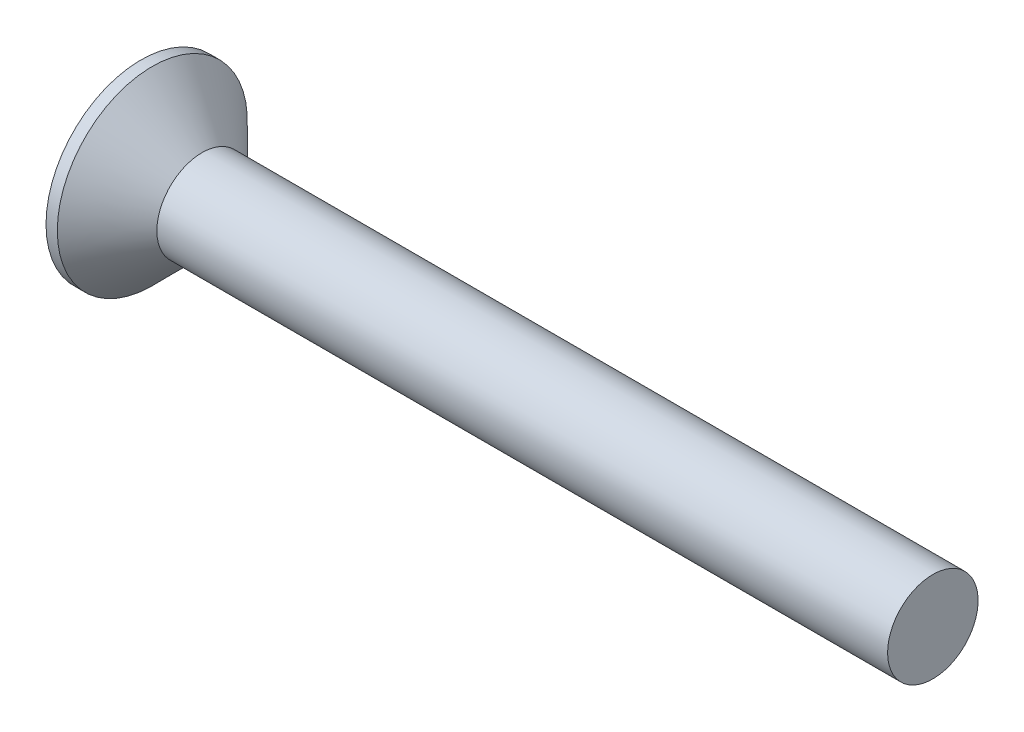
ISO-10303-21;
HEADER;
FILE_DESCRIPTION(('STEP AP214'),'2;1');
FILE_NAME('part.step','',(''),(''),'','','');
FILE_SCHEMA(('AUTOMOTIVE_DESIGN { 1 0 10303 214 1 1 1 1 }'));
ENDSEC;
DATA;
#1=APPLICATION_CONTEXT('core data for automotive mechanical design processes');
#2=APPLICATION_PROTOCOL_DEFINITION('international standard','automotive_design',2000,#1);
#3=PRODUCT_CONTEXT('',#1,'mechanical');
#4=PRODUCT('Part','Part','',(#3));
#5=PRODUCT_RELATED_PRODUCT_CATEGORY('part','',(#4));
#6=PRODUCT_DEFINITION_FORMATION('','',#4);
#7=PRODUCT_DEFINITION_CONTEXT('part definition',#1,'design');
#8=PRODUCT_DEFINITION('design','',#6,#7);
#9=PRODUCT_DEFINITION_SHAPE('','',#8);
#10=(LENGTH_UNIT() NAMED_UNIT(*) SI_UNIT(.MILLI.,.METRE.));
#11=(NAMED_UNIT(*) PLANE_ANGLE_UNIT() SI_UNIT($,.RADIAN.));
#12=(NAMED_UNIT(*) SI_UNIT($,.STERADIAN.) SOLID_ANGLE_UNIT());
#13=UNCERTAINTY_MEASURE_WITH_UNIT(LENGTH_MEASURE(1.E-05),#10,'distance_accuracy_value','');
#14=(GEOMETRIC_REPRESENTATION_CONTEXT(3) GLOBAL_UNCERTAINTY_ASSIGNED_CONTEXT((#13)) GLOBAL_UNIT_ASSIGNED_CONTEXT((#10,
#11,#12)) REPRESENTATION_CONTEXT('',''));
#15=CARTESIAN_POINT('',(0.,0.,0.));
#16=DIRECTION('',(0.,0.,1.));
#17=DIRECTION('',(1.,0.,0.));
#18=AXIS2_PLACEMENT_3D('',#15,#16,#17);
#19=CARTESIAN_POINT('',(0.,0.,0.));
#20=DIRECTION('',(-1.,0.,0.));
#21=DIRECTION('',(0.,0.,1.));
#22=AXIS2_PLACEMENT_3D('',#19,#20,#21);
#23=PLANE('',#22);
#24=CARTESIAN_POINT('',(0.,0.,0.));
#25=DIRECTION('',(-1.,0.,0.));
#26=DIRECTION('',(0.,0.,1.));
#27=AXIS2_PLACEMENT_3D('',#24,#25,#26);
#28=CIRCLE('',#27,4.2);
#29=CARTESIAN_POINT('',(0.,0.,4.2));
#30=VERTEX_POINT('',#29);
#31=EDGE_CURVE('E41',#30,#30,#28,.T.);
#32=ORIENTED_EDGE('',*,*,#31,.T.);
#33=EDGE_LOOP('',(#32));
#34=FACE_BOUND('',#33,.T.);
#35=DIRECTION('',(0.,1.,0.));
#36=VECTOR('',#35,1.);
#37=CARTESIAN_POINT('',(0.,-2.23,-0.48));
#38=LINE('',#37,#36);
#39=CARTESIAN_POINT('',(0.,-2.23,-0.48));
#40=VERTEX_POINT('',#39);
#41=CARTESIAN_POINT('',(0.,-0.479999999999998,-0.48));
#42=VERTEX_POINT('',#41);
#43=EDGE_CURVE('E102',#40,#42,#38,.T.);
#44=ORIENTED_EDGE('',*,*,#43,.T.);
#45=DIRECTION('',(0.,0.,-1.));
#46=VECTOR('',#45,1.);
#47=CARTESIAN_POINT('',(0.,-0.480000000000008,2.23));
#48=LINE('',#47,#46);
#49=CARTESIAN_POINT('',(0.,-0.479999999999992,-2.23));
#50=VERTEX_POINT('',#49);
#51=EDGE_CURVE('E82',#42,#50,#48,.T.);
#52=ORIENTED_EDGE('',*,*,#51,.T.);
#53=DIRECTION('',(0.,1.,0.));
#54=VECTOR('',#53,1.);
#55=CARTESIAN_POINT('',(0.,-0.479999999999992,-2.23));
#56=LINE('',#55,#54);
#57=CARTESIAN_POINT('',(0.,0.480000000000008,-2.23));
#58=VERTEX_POINT('',#57);
#59=EDGE_CURVE('E339',#50,#58,#56,.T.);
#60=ORIENTED_EDGE('',*,*,#59,.T.);
#61=DIRECTION('',(0.,0.,1.));
#62=VECTOR('',#61,1.);
#63=CARTESIAN_POINT('',(0.,0.480000000000008,-2.23));
#64=LINE('',#63,#62);
#65=CARTESIAN_POINT('',(0.,0.480000000000001,-0.48));
#66=VERTEX_POINT('',#65);
#67=EDGE_CURVE('E98',#58,#66,#64,.T.);
#68=ORIENTED_EDGE('',*,*,#67,.T.);
#69=CARTESIAN_POINT('',(0.,2.23,-0.48));
#70=VERTEX_POINT('',#69);
#71=EDGE_CURVE('E92',#66,#70,#38,.T.);
#72=ORIENTED_EDGE('',*,*,#71,.T.);
#73=DIRECTION('',(0.,0.,1.));
#74=VECTOR('',#73,1.);
#75=CARTESIAN_POINT('',(0.,2.23,-0.48));
#76=LINE('',#75,#74);
#77=CARTESIAN_POINT('',(0.,2.23,0.48));
#78=VERTEX_POINT('',#77);
#79=EDGE_CURVE('E95',#70,#78,#76,.T.);
#80=ORIENTED_EDGE('',*,*,#79,.T.);
#81=DIRECTION('',(0.,-1.,0.));
#82=VECTOR('',#81,1.);
#83=CARTESIAN_POINT('',(0.,2.23,0.48));
#84=LINE('',#83,#82);
#85=CARTESIAN_POINT('',(0.,0.479999999999998,0.48));
#86=VERTEX_POINT('',#85);
#87=EDGE_CURVE('E351',#78,#86,#84,.T.);
#88=ORIENTED_EDGE('',*,*,#87,.T.);
#89=CARTESIAN_POINT('',(0.,0.479999999999992,2.23));
#90=VERTEX_POINT('',#89);
#91=EDGE_CURVE('E334',#86,#90,#64,.T.);
#92=ORIENTED_EDGE('',*,*,#91,.T.);
#93=DIRECTION('',(0.,-1.,0.));
#94=VECTOR('',#93,1.);
#95=CARTESIAN_POINT('',(0.,0.479999999999992,2.23));
#96=LINE('',#95,#94);
#97=CARTESIAN_POINT('',(0.,-0.480000000000008,2.23));
#98=VERTEX_POINT('',#97);
#99=EDGE_CURVE('E320',#90,#98,#96,.T.);
#100=ORIENTED_EDGE('',*,*,#99,.T.);
#101=CARTESIAN_POINT('',(0.,-0.480000000000002,0.48));
#102=VERTEX_POINT('',#101);
#103=EDGE_CURVE('E332',#98,#102,#48,.T.);
#104=ORIENTED_EDGE('',*,*,#103,.T.);
#105=CARTESIAN_POINT('',(0.,-2.23,0.48));
#106=VERTEX_POINT('',#105);
#107=EDGE_CURVE('E108',#102,#106,#84,.T.);
#108=ORIENTED_EDGE('',*,*,#107,.T.);
#109=DIRECTION('',(0.,0.,-1.));
#110=VECTOR('',#109,1.);
#111=CARTESIAN_POINT('',(0.,-2.23,0.48));
#112=LINE('',#111,#110);
#113=EDGE_CURVE('E131',#106,#40,#112,.T.);
#114=ORIENTED_EDGE('',*,*,#113,.T.);
#115=EDGE_LOOP('',(#44,#52,#60,#68,#72,#80,#88,#92,#100,#104,#108,#114));
#116=FACE_BOUND('',#115,.T.);
#117=ADVANCED_FACE('F34',(#34,#116),#23,.T.);
#118=CARTESIAN_POINT('',(2.96959798994975,0.,0.211055276381909));
#119=DIRECTION('',(-0.0901968863789278,0.,-0.995923953767328));
#120=DIRECTION('',(-0.995923953767328,0.,0.0901968863789278));
#121=AXIS2_PLACEMENT_3D('',#118,#119,#120);
#122=PLANE('',#121);
#123=ORIENTED_EDGE('',*,*,#107,.F.);
#124=DIRECTION('',(0.991897347093265,0.0898322125669375,-0.0898322125669372));
#125=VECTOR('',#124,1.);
#126=CARTESIAN_POINT('',(2.98840392964726,-0.209352096937608,0.209352096937607));
#127=LINE('',#126,#125);
#128=CARTESIAN_POINT('',(2.65,-0.240000000000001,0.239999999999999));
#129=VERTEX_POINT('',#128);
#130=EDGE_CURVE('E126',#102,#129,#127,.T.);
#131=ORIENTED_EDGE('',*,*,#130,.T.);
#132=DIRECTION('',(0.797549052549738,0.59891419417886,-0.0722308575894103));
#133=VECTOR('',#132,1.);
#134=CARTESIAN_POINT('',(0.,-2.23,0.48));
#135=LINE('',#134,#133);
#136=EDGE_CURVE('E103',#106,#129,#135,.T.);
#137=ORIENTED_EDGE('',*,*,#136,.F.);
#138=EDGE_LOOP('',(#123,#131,#137));
#139=FACE_BOUND('',#138,.T.);
#140=ADVANCED_FACE('F154',(#139),#122,.T.);
#141=DIRECTION('',(0.797549052549738,-0.59891419417886,-0.0722308575894102));
#142=VECTOR('',#141,1.);
#143=CARTESIAN_POINT('',(0.,2.23,0.48));
#144=LINE('',#143,#142);
#145=CARTESIAN_POINT('',(2.65,0.24,0.24));
#146=VERTEX_POINT('',#145);
#147=EDGE_CURVE('E48',#78,#146,#144,.T.);
#148=ORIENTED_EDGE('',*,*,#147,.T.);
#149=DIRECTION('',(-0.991897347093265,0.0898322125669368,0.0898322125669372));
#150=VECTOR('',#149,1.);
#151=CARTESIAN_POINT('',(2.98840392964726,0.209352096937606,0.209352096937607));
#152=LINE('',#151,#150);
#153=EDGE_CURVE('E347',#146,#86,#152,.T.);
#154=ORIENTED_EDGE('',*,*,#153,.T.);
#155=ORIENTED_EDGE('',*,*,#87,.F.);
#156=EDGE_LOOP('',(#148,#154,#155));
#157=FACE_BOUND('',#156,.T.);
#158=ADVANCED_FACE('F158',(#157),#122,.T.);
#159=CARTESIAN_POINT('',(2.96959798994975,0.,-0.21105527638191));
#160=DIRECTION('',(-0.0901968863789277,0.,0.995923953767328));
#161=DIRECTION('',(0.995923953767328,0.,0.0901968863789277));
#162=AXIS2_PLACEMENT_3D('',#159,#160,#161);
#163=PLANE('',#162);
#164=DIRECTION('',(0.797549052549738,0.59891419417886,0.0722308575894102));
#165=VECTOR('',#164,1.);
#166=CARTESIAN_POINT('',(0.,-2.23,-0.48));
#167=LINE('',#166,#165);
#168=CARTESIAN_POINT('',(2.65,-0.239999999999999,-0.240000000000001));
#169=VERTEX_POINT('',#168);
#170=EDGE_CURVE('E57',#40,#169,#167,.T.);
#171=ORIENTED_EDGE('',*,*,#170,.T.);
#172=DIRECTION('',(-0.991897347093265,-0.0898322125669369,-0.0898322125669372));
#173=VECTOR('',#172,1.);
#174=CARTESIAN_POINT('',(2.98840392964726,-0.209352096937606,-0.209352096937607));
#175=LINE('',#174,#173);
#176=EDGE_CURVE('E11',#169,#42,#175,.T.);
#177=ORIENTED_EDGE('',*,*,#176,.T.);
#178=ORIENTED_EDGE('',*,*,#43,.F.);
#179=EDGE_LOOP('',(#171,#177,#178));
#180=FACE_BOUND('',#179,.T.);
#181=ADVANCED_FACE('F151',(#180),#163,.T.);
#182=ORIENTED_EDGE('',*,*,#71,.F.);
#183=DIRECTION('',(0.991897347093265,-0.0898322125669375,0.0898322125669371));
#184=VECTOR('',#183,1.);
#185=CARTESIAN_POINT('',(2.98840392964726,0.209352096937608,-0.209352096937607));
#186=LINE('',#185,#184);
#187=CARTESIAN_POINT('',(2.65,0.24,-0.24));
#188=VERTEX_POINT('',#187);
#189=EDGE_CURVE('E111',#66,#188,#186,.T.);
#190=ORIENTED_EDGE('',*,*,#189,.T.);
#191=DIRECTION('',(0.797549052549738,-0.59891419417886,0.0722308575894102));
#192=VECTOR('',#191,1.);
#193=CARTESIAN_POINT('',(0.,2.23,-0.48));
#194=LINE('',#193,#192);
#195=EDGE_CURVE('E107',#70,#188,#194,.T.);
#196=ORIENTED_EDGE('',*,*,#195,.F.);
#197=EDGE_LOOP('',(#182,#190,#196));
#198=FACE_BOUND('',#197,.T.);
#199=ADVANCED_FACE('F110',(#198),#163,.T.);
#200=CARTESIAN_POINT('',(-6.34999999999999,0.,0.));
#201=DIRECTION('',(-1.,0.,0.));
#202=DIRECTION('',(0.,0.,1.));
#203=AXIS2_PLACEMENT_3D('',#200,#201,#202);
#204=CYLINDRICAL_SURFACE('',#203,4.2);
#205=CARTESIAN_POINT('',(0.500000000000007,0.,0.));
#206=DIRECTION('',(-1.,0.,0.));
#207=DIRECTION('',(0.,0.,1.));
#208=AXIS2_PLACEMENT_3D('',#205,#206,#207);
#209=CIRCLE('',#208,4.2);
#210=CARTESIAN_POINT('',(0.500000000000007,0.,4.2));
#211=VERTEX_POINT('',#210);
#212=EDGE_CURVE('E134',#211,#211,#209,.T.);
#213=ORIENTED_EDGE('',*,*,#212,.T.);
#214=EDGE_LOOP('',(#213));
#215=FACE_BOUND('',#214,.T.);
#216=ORIENTED_EDGE('',*,*,#31,.F.);
#217=EDGE_LOOP('',(#216));
#218=FACE_BOUND('',#217,.T.);
#219=ADVANCED_FACE('F140',(#215,#218),#204,.T.);
#220=CARTESIAN_POINT('',(0.500000000000007,0.,0.));
#221=DIRECTION('',(-1.,0.,0.));
#222=DIRECTION('',(0.,0.,1.));
#223=AXIS2_PLACEMENT_3D('',#220,#221,#222);
#224=CONICAL_SURFACE('',#223,4.2,0.78539816339745);
#225=CARTESIAN_POINT('',(2.7,0.,0.));
#226=DIRECTION('',(-1.,0.,0.));
#227=DIRECTION('',(0.,0.,1.));
#228=AXIS2_PLACEMENT_3D('',#225,#226,#227);
#229=CIRCLE('',#228,2.);
#230=CARTESIAN_POINT('',(2.7,0.,2.));
#231=VERTEX_POINT('',#230);
#232=EDGE_CURVE('E130',#231,#231,#229,.T.);
#233=ORIENTED_EDGE('',*,*,#232,.T.);
#234=EDGE_LOOP('',(#233));
#235=FACE_BOUND('',#234,.T.);
#236=ORIENTED_EDGE('',*,*,#212,.F.);
#237=EDGE_LOOP('',(#236));
#238=FACE_BOUND('',#237,.T.);
#239=ADVANCED_FACE('F142',(#235,#238),#224,.T.);
#240=CARTESIAN_POINT('',(-6.34999999999999,0.,0.));
#241=DIRECTION('',(-1.,0.,0.));
#242=DIRECTION('',(0.,0.,1.));
#243=AXIS2_PLACEMENT_3D('',#240,#241,#242);
#244=CYLINDRICAL_SURFACE('',#243,2.);
#245=CARTESIAN_POINT('',(35.,0.,0.));
#246=DIRECTION('',(-1.,0.,0.));
#247=DIRECTION('',(0.,0.,1.));
#248=AXIS2_PLACEMENT_3D('',#245,#246,#247);
#249=CIRCLE('',#248,2.);
#250=CARTESIAN_POINT('',(35.,0.,2.));
#251=VERTEX_POINT('',#250);
#252=EDGE_CURVE('E127',#251,#251,#249,.T.);
#253=ORIENTED_EDGE('',*,*,#252,.T.);
#254=EDGE_LOOP('',(#253));
#255=FACE_BOUND('',#254,.T.);
#256=ORIENTED_EDGE('',*,*,#232,.F.);
#257=EDGE_LOOP('',(#256));
#258=FACE_BOUND('',#257,.T.);
#259=ADVANCED_FACE('F148',(#255,#258),#244,.T.);
#260=CARTESIAN_POINT('',(35.,2.,0.));
#261=DIRECTION('',(1.,0.,0.));
#262=DIRECTION('',(0.,0.,-1.));
#263=AXIS2_PLACEMENT_3D('',#260,#261,#262);
#264=PLANE('',#263);
#265=ORIENTED_EDGE('',*,*,#252,.F.);
#266=EDGE_LOOP('',(#265));
#267=FACE_BOUND('',#266,.T.);
#268=ADVANCED_FACE('F178',(#267),#264,.T.);
#269=CARTESIAN_POINT('',(2.65,0.24,-0.24));
#270=DIRECTION('',(1.,0.,0.));
#271=DIRECTION('',(0.,0.,-1.));
#272=AXIS2_PLACEMENT_3D('',#269,#270,#271);
#273=PLANE('',#272);
#274=DIRECTION('',(0.,1.,0.));
#275=VECTOR('',#274,1.);
#276=CARTESIAN_POINT('',(2.65,-0.24,-0.24));
#277=LINE('',#276,#275);
#278=EDGE_CURVE('E122',#169,#188,#277,.T.);
#279=ORIENTED_EDGE('',*,*,#278,.F.);
#280=DIRECTION('',(0.,0.,-1.));
#281=VECTOR('',#280,1.);
#282=CARTESIAN_POINT('',(2.65,-0.24,0.24));
#283=LINE('',#282,#281);
#284=EDGE_CURVE('E113',#129,#169,#283,.T.);
#285=ORIENTED_EDGE('',*,*,#284,.F.);
#286=DIRECTION('',(0.,-1.,0.));
#287=VECTOR('',#286,1.);
#288=CARTESIAN_POINT('',(2.65,0.24,0.24));
#289=LINE('',#288,#287);
#290=EDGE_CURVE('E116',#146,#129,#289,.T.);
#291=ORIENTED_EDGE('',*,*,#290,.F.);
#292=DIRECTION('',(0.,0.,1.));
#293=VECTOR('',#292,1.);
#294=CARTESIAN_POINT('',(2.65,0.24,-0.24));
#295=LINE('',#294,#293);
#296=EDGE_CURVE('E120',#188,#146,#295,.T.);
#297=ORIENTED_EDGE('',*,*,#296,.F.);
#298=EDGE_LOOP('',(#279,#285,#291,#297));
#299=FACE_BOUND('',#298,.T.);
#300=ADVANCED_FACE('F175',(#299),#273,.F.);
#301=CARTESIAN_POINT('',(0.,-2.23,-0.48));
#302=DIRECTION('',(-0.600482690889725,0.799637754199885,0.));
#303=DIRECTION('',(-0.799637754199885,-0.600482690889725,0.));
#304=AXIS2_PLACEMENT_3D('',#301,#302,#303);
#305=PLANE('',#304);
#306=ORIENTED_EDGE('',*,*,#170,.F.);
#307=ORIENTED_EDGE('',*,*,#113,.F.);
#308=ORIENTED_EDGE('',*,*,#136,.T.);
#309=ORIENTED_EDGE('',*,*,#284,.T.);
#310=EDGE_LOOP('',(#306,#307,#308,#309));
#311=FACE_BOUND('',#310,.T.);
#312=ADVANCED_FACE('F167',(#311),#305,.T.);
#313=CARTESIAN_POINT('',(2.65,0.24,0.24));
#314=DIRECTION('',(-0.600482690889725,-0.799637754199885,0.));
#315=DIRECTION('',(0.799637754199885,-0.600482690889725,0.));
#316=AXIS2_PLACEMENT_3D('',#313,#314,#315);
#317=PLANE('',#316);
#318=ORIENTED_EDGE('',*,*,#147,.F.);
#319=ORIENTED_EDGE('',*,*,#79,.F.);
#320=ORIENTED_EDGE('',*,*,#195,.T.);
#321=ORIENTED_EDGE('',*,*,#296,.T.);
#322=EDGE_LOOP('',(#318,#319,#320,#321));
#323=FACE_BOUND('',#322,.T.);
#324=ADVANCED_FACE('F106',(#323),#317,.T.);
#325=CARTESIAN_POINT('',(2.96959798994975,-0.211055276381909,0.));
#326=DIRECTION('',(-0.0901968863789278,0.995923953767328,0.));
#327=DIRECTION('',(-0.995923953767328,-0.0901968863789278,0.));
#328=AXIS2_PLACEMENT_3D('',#325,#326,#327);
#329=PLANE('',#328);
#330=DIRECTION('',(0.797549052549738,0.0722308575894082,0.59891419417886));
#331=VECTOR('',#330,1.);
#332=CARTESIAN_POINT('',(0.,-0.479999999999992,-2.23));
#333=LINE('',#332,#331);
#334=EDGE_CURVE('E341',#50,#169,#333,.T.);
#335=ORIENTED_EDGE('',*,*,#334,.F.);
#336=ORIENTED_EDGE('',*,*,#51,.F.);
#337=ORIENTED_EDGE('',*,*,#176,.F.);
#338=EDGE_LOOP('',(#335,#336,#337));
#339=FACE_BOUND('',#338,.T.);
#340=ADVANCED_FACE('F174',(#339),#329,.T.);
#341=CARTESIAN_POINT('',(2.96959798994975,0.21105527638191,0.));
#342=DIRECTION('',(-0.0901968863789277,-0.995923953767328,0.));
#343=DIRECTION('',(0.995923953767328,-0.0901968863789277,0.));
#344=AXIS2_PLACEMENT_3D('',#341,#342,#343);
#345=PLANE('',#344);
#346=ORIENTED_EDGE('',*,*,#67,.F.);
#347=DIRECTION('',(0.797549052549738,-0.0722308575894123,0.59891419417886));
#348=VECTOR('',#347,1.);
#349=CARTESIAN_POINT('',(0.,0.480000000000008,-2.23));
#350=LINE('',#349,#348);
#351=EDGE_CURVE('E73',#58,#188,#350,.T.);
#352=ORIENTED_EDGE('',*,*,#351,.T.);
#353=ORIENTED_EDGE('',*,*,#189,.F.);
#354=EDGE_LOOP('',(#346,#352,#353));
#355=FACE_BOUND('',#354,.T.);
#356=ADVANCED_FACE('F218',(#355),#345,.T.);
#357=CARTESIAN_POINT('',(0.,0.480000000000008,-2.23));
#358=DIRECTION('',(-0.600482690889725,0.,0.799637754199885));
#359=DIRECTION('',(-0.799637754199885,0.,-0.600482690889725));
#360=AXIS2_PLACEMENT_3D('',#357,#358,#359);
#361=PLANE('',#360);
#362=ORIENTED_EDGE('',*,*,#351,.F.);
#363=ORIENTED_EDGE('',*,*,#59,.F.);
#364=ORIENTED_EDGE('',*,*,#334,.T.);
#365=ORIENTED_EDGE('',*,*,#278,.T.);
#366=EDGE_LOOP('',(#362,#363,#364,#365));
#367=FACE_BOUND('',#366,.T.);
#368=ADVANCED_FACE('F226',(#367),#361,.T.);
#369=ORIENTED_EDGE('',*,*,#103,.F.);
#370=DIRECTION('',(0.797549052549738,0.0722308575894123,-0.59891419417886));
#371=VECTOR('',#370,1.);
#372=CARTESIAN_POINT('',(0.,-0.480000000000008,2.23));
#373=LINE('',#372,#371);
#374=EDGE_CURVE('E317',#98,#129,#373,.T.);
#375=ORIENTED_EDGE('',*,*,#374,.T.);
#376=ORIENTED_EDGE('',*,*,#130,.F.);
#377=EDGE_LOOP('',(#369,#375,#376));
#378=FACE_BOUND('',#377,.T.);
#379=ADVANCED_FACE('F220',(#378),#329,.T.);
#380=DIRECTION('',(0.797549052549738,-0.0722308575894081,-0.59891419417886));
#381=VECTOR('',#380,1.);
#382=CARTESIAN_POINT('',(0.,0.479999999999992,2.23));
#383=LINE('',#382,#381);
#384=EDGE_CURVE('E328',#90,#146,#383,.T.);
#385=ORIENTED_EDGE('',*,*,#384,.F.);
#386=ORIENTED_EDGE('',*,*,#91,.F.);
#387=ORIENTED_EDGE('',*,*,#153,.F.);
#388=EDGE_LOOP('',(#385,#386,#387));
#389=FACE_BOUND('',#388,.T.);
#390=ADVANCED_FACE('F228',(#389),#345,.T.);
#391=CARTESIAN_POINT('',(2.65,-0.240000000000001,0.239999999999999));
#392=DIRECTION('',(-0.600482690889725,0.,-0.799637754199885));
#393=DIRECTION('',(0.799637754199885,0.,-0.600482690889725));
#394=AXIS2_PLACEMENT_3D('',#391,#392,#393);
#395=PLANE('',#394);
#396=ORIENTED_EDGE('',*,*,#374,.F.);
#397=ORIENTED_EDGE('',*,*,#99,.F.);
#398=ORIENTED_EDGE('',*,*,#384,.T.);
#399=ORIENTED_EDGE('',*,*,#290,.T.);
#400=EDGE_LOOP('',(#396,#397,#398,#399));
#401=FACE_BOUND('',#400,.T.);
#402=ADVANCED_FACE('F247',(#401),#395,.T.);
#403=CLOSED_SHELL('',(#117,#140,#158,#181,#199,#219,#239,#259,#268,#300,#312,#324,#340,#356,
#368,#379,#390,#402));
#404=MANIFOLD_SOLID_BREP('B2',#403);
#405=ADVANCED_BREP_SHAPE_REPRESENTATION('',(#18,#404),#14);
#406=SHAPE_DEFINITION_REPRESENTATION(#9,#405);
ENDSEC;
END-ISO-10303-21;
